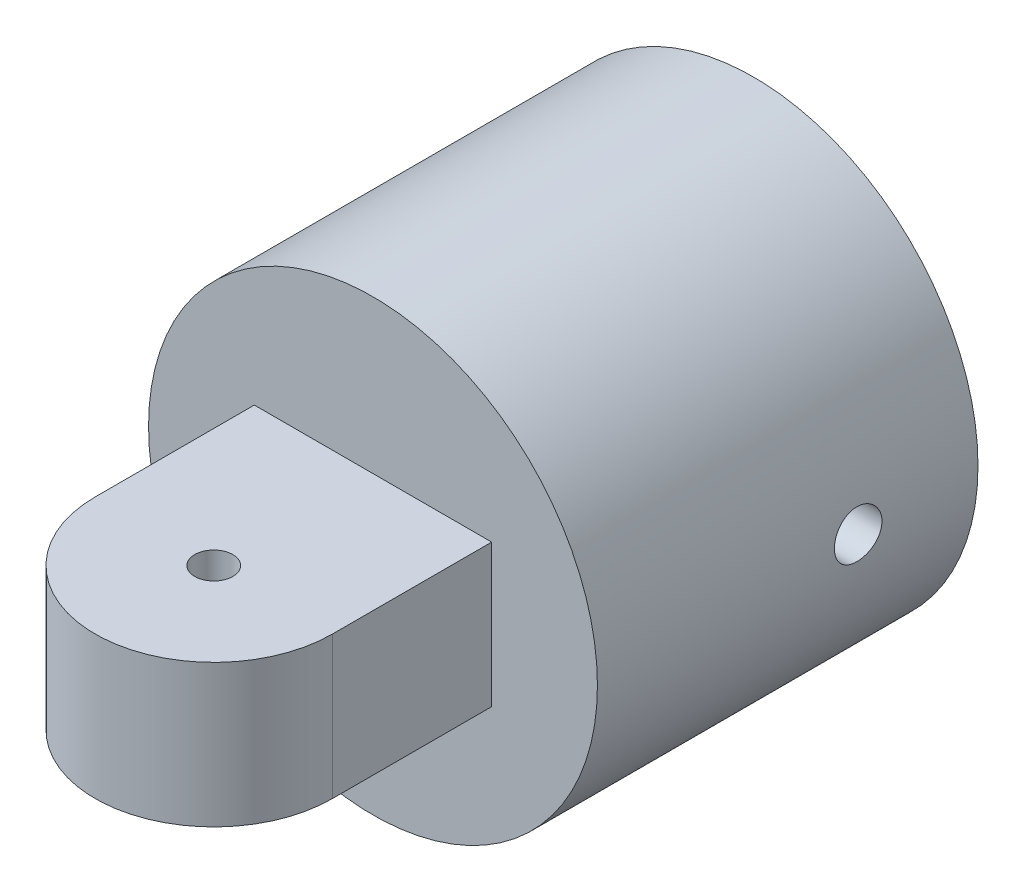
ISO-10303-21;
HEADER;
FILE_DESCRIPTION(('STEP AP214'),'2;1');
FILE_NAME('part.step','',(''),(''),'','','');
FILE_SCHEMA(('AUTOMOTIVE_DESIGN { 1 0 10303 214 1 1 1 1 }'));
ENDSEC;
DATA;
#1=APPLICATION_CONTEXT('core data for automotive mechanical design processes');
#2=APPLICATION_PROTOCOL_DEFINITION('international standard','automotive_design',2000,#1);
#3=PRODUCT_CONTEXT('',#1,'mechanical');
#4=PRODUCT('Part','Part','',(#3));
#5=PRODUCT_RELATED_PRODUCT_CATEGORY('part','',(#4));
#6=PRODUCT_DEFINITION_FORMATION('','',#4);
#7=PRODUCT_DEFINITION_CONTEXT('part definition',#1,'design');
#8=PRODUCT_DEFINITION('design','',#6,#7);
#9=PRODUCT_DEFINITION_SHAPE('','',#8);
#10=(LENGTH_UNIT() NAMED_UNIT(*) SI_UNIT(.MILLI.,.METRE.));
#11=(NAMED_UNIT(*) PLANE_ANGLE_UNIT() SI_UNIT($,.RADIAN.));
#12=(NAMED_UNIT(*) SI_UNIT($,.STERADIAN.) SOLID_ANGLE_UNIT());
#13=UNCERTAINTY_MEASURE_WITH_UNIT(LENGTH_MEASURE(1.E-05),#10,'distance_accuracy_value','');
#14=(GEOMETRIC_REPRESENTATION_CONTEXT(3) GLOBAL_UNCERTAINTY_ASSIGNED_CONTEXT((#13)) GLOBAL_UNIT_ASSIGNED_CONTEXT((#10,
#11,#12)) REPRESENTATION_CONTEXT('',''));
#15=CARTESIAN_POINT('',(0.,0.,0.));
#16=DIRECTION('',(0.,0.,1.));
#17=DIRECTION('',(1.,0.,0.));
#18=AXIS2_PLACEMENT_3D('',#15,#16,#17);
#19=CARTESIAN_POINT('',(0.,7.49,46.7347256348819));
#20=DIRECTION('',(0.,-1.,0.));
#21=DIRECTION('',(0.,0.,-1.));
#22=AXIS2_PLACEMENT_3D('',#19,#20,#21);
#23=CYLINDRICAL_SURFACE('',#22,12.4735073454206);
#24=CARTESIAN_POINT('',(0.,-7.49,46.7347256348819));
#25=DIRECTION('',(0.,1.,0.));
#26=DIRECTION('',(0.,0.,1.));
#27=AXIS2_PLACEMENT_3D('',#24,#25,#26);
#28=CIRCLE('',#27,12.4735073454206);
#29=CARTESIAN_POINT('',(-12.4735073454206,-7.49,46.7347256348819));
#30=VERTEX_POINT('',#29);
#31=CARTESIAN_POINT('',(12.4735073454206,-7.49,46.7347256348819));
#32=VERTEX_POINT('',#31);
#33=EDGE_CURVE('E112',#30,#32,#28,.T.);
#34=ORIENTED_EDGE('',*,*,#33,.T.);
#35=DIRECTION('',(0.,-1.,0.));
#36=VECTOR('',#35,1.);
#37=CARTESIAN_POINT('',(12.4735073454206,7.49,46.7347256348819));
#38=LINE('',#37,#36);
#39=CARTESIAN_POINT('',(12.4735073454206,7.49,46.7347256348819));
#40=VERTEX_POINT('',#39);
#41=EDGE_CURVE('E12',#40,#32,#38,.T.);
#42=ORIENTED_EDGE('',*,*,#41,.F.);
#43=CARTESIAN_POINT('',(0.,7.49,46.7347256348819));
#44=DIRECTION('',(0.,1.,0.));
#45=DIRECTION('',(0.,0.,1.));
#46=AXIS2_PLACEMENT_3D('',#43,#44,#45);
#47=CIRCLE('',#46,12.4735073454206);
#48=CARTESIAN_POINT('',(-12.4735073454206,7.49,46.7347256348819));
#49=VERTEX_POINT('',#48);
#50=EDGE_CURVE('E99',#49,#40,#47,.T.);
#51=ORIENTED_EDGE('',*,*,#50,.F.);
#52=DIRECTION('',(0.,-1.,0.));
#53=VECTOR('',#52,1.);
#54=CARTESIAN_POINT('',(-12.4735073454206,7.49,46.7347256348819));
#55=LINE('',#54,#53);
#56=EDGE_CURVE('E108',#49,#30,#55,.T.);
#57=ORIENTED_EDGE('',*,*,#56,.T.);
#58=EDGE_LOOP('',(#34,#42,#51,#57));
#59=FACE_BOUND('',#58,.T.);
#60=ADVANCED_FACE('F47',(#59),#23,.T.);
#61=CARTESIAN_POINT('',(12.4735073454206,7.49,46.7347256348819));
#62=DIRECTION('',(-1.,0.,0.));
#63=DIRECTION('',(0.,0.,1.));
#64=AXIS2_PLACEMENT_3D('',#61,#62,#63);
#65=PLANE('',#64);
#66=DIRECTION('',(0.,0.,-1.));
#67=VECTOR('',#66,1.);
#68=CARTESIAN_POINT('',(12.4735073454206,-7.49,46.7347256348819));
#69=LINE('',#68,#67);
#70=CARTESIAN_POINT('',(12.4735073454206,-7.49,30.));
#71=VERTEX_POINT('',#70);
#72=EDGE_CURVE('E103',#32,#71,#69,.T.);
#73=ORIENTED_EDGE('',*,*,#72,.T.);
#74=DIRECTION('',(0.,-1.,0.));
#75=VECTOR('',#74,1.);
#76=CARTESIAN_POINT('',(12.4735073454206,7.49,30.));
#77=LINE('',#76,#75);
#78=CARTESIAN_POINT('',(12.4735073454206,7.49,30.));
#79=VERTEX_POINT('',#78);
#80=EDGE_CURVE('E56',#79,#71,#77,.T.);
#81=ORIENTED_EDGE('',*,*,#80,.F.);
#82=DIRECTION('',(0.,0.,-1.));
#83=VECTOR('',#82,1.);
#84=CARTESIAN_POINT('',(12.4735073454206,7.49,46.7347256348819));
#85=LINE('',#84,#83);
#86=EDGE_CURVE('E94',#40,#79,#85,.T.);
#87=ORIENTED_EDGE('',*,*,#86,.F.);
#88=ORIENTED_EDGE('',*,*,#41,.T.);
#89=EDGE_LOOP('',(#73,#81,#87,#88));
#90=FACE_BOUND('',#89,.T.);
#91=ADVANCED_FACE('F102',(#90),#65,.F.);
#92=CARTESIAN_POINT('',(-12.4735073454206,7.49,30.));
#93=DIRECTION('',(0.,0.,1.));
#94=DIRECTION('',(1.,0.,0.));
#95=AXIS2_PLACEMENT_3D('',#92,#93,#94);
#96=PLANE('',#95);
#97=DIRECTION('',(-1.,0.,0.));
#98=VECTOR('',#97,1.);
#99=CARTESIAN_POINT('',(-12.4735073454206,-7.49,30.));
#100=LINE('',#99,#98);
#101=CARTESIAN_POINT('',(-12.4735073454206,-7.49,30.));
#102=VERTEX_POINT('',#101);
#103=EDGE_CURVE('E81',#71,#102,#100,.T.);
#104=ORIENTED_EDGE('',*,*,#103,.T.);
#105=DIRECTION('',(0.,-1.,0.));
#106=VECTOR('',#105,1.);
#107=CARTESIAN_POINT('',(-12.4735073454206,7.49,30.));
#108=LINE('',#107,#106);
#109=CARTESIAN_POINT('',(-12.4735073454206,7.49,30.));
#110=VERTEX_POINT('',#109);
#111=EDGE_CURVE('E104',#110,#102,#108,.T.);
#112=ORIENTED_EDGE('',*,*,#111,.F.);
#113=DIRECTION('',(-1.,0.,0.));
#114=VECTOR('',#113,1.);
#115=CARTESIAN_POINT('',(-12.4735073454206,7.49,30.));
#116=LINE('',#115,#114);
#117=EDGE_CURVE('E97',#79,#110,#116,.T.);
#118=ORIENTED_EDGE('',*,*,#117,.F.);
#119=ORIENTED_EDGE('',*,*,#80,.T.);
#120=EDGE_LOOP('',(#104,#112,#118,#119));
#121=FACE_BOUND('',#120,.T.);
#122=ADVANCED_FACE('F106',(#121),#96,.F.);
#123=CARTESIAN_POINT('',(-12.4735073454206,7.49,30.));
#124=DIRECTION('',(1.,0.,0.));
#125=DIRECTION('',(0.,0.,-1.));
#126=AXIS2_PLACEMENT_3D('',#123,#124,#125);
#127=PLANE('',#126);
#128=DIRECTION('',(0.,0.,1.));
#129=VECTOR('',#128,1.);
#130=CARTESIAN_POINT('',(-12.4735073454206,-7.49,30.));
#131=LINE('',#130,#129);
#132=EDGE_CURVE('E87',#102,#30,#131,.T.);
#133=ORIENTED_EDGE('',*,*,#132,.T.);
#134=ORIENTED_EDGE('',*,*,#56,.F.);
#135=DIRECTION('',(0.,0.,1.));
#136=VECTOR('',#135,1.);
#137=CARTESIAN_POINT('',(-12.4735073454206,7.49,30.));
#138=LINE('',#137,#136);
#139=EDGE_CURVE('E64',#110,#49,#138,.T.);
#140=ORIENTED_EDGE('',*,*,#139,.F.);
#141=ORIENTED_EDGE('',*,*,#111,.T.);
#142=EDGE_LOOP('',(#133,#134,#140,#141));
#143=FACE_BOUND('',#142,.T.);
#144=ADVANCED_FACE('F120',(#143),#127,.F.);
#145=CARTESIAN_POINT('',(0.,7.49,46.7347256348819));
#146=DIRECTION('',(0.,1.,0.));
#147=DIRECTION('',(0.,0.,1.));
#148=AXIS2_PLACEMENT_3D('',#145,#146,#147);
#149=PLANE('',#148);
#150=CARTESIAN_POINT('',(0.,7.49,46.7347256348819));
#151=DIRECTION('',(0.,1.,0.));
#152=DIRECTION('',(0.,0.,1.));
#153=AXIS2_PLACEMENT_3D('',#150,#151,#152);
#154=CIRCLE('',#153,2.);
#155=CARTESIAN_POINT('',(0.,7.49,48.7347256348819));
#156=VERTEX_POINT('',#155);
#157=EDGE_CURVE('E115',#156,#156,#154,.T.);
#158=ORIENTED_EDGE('',*,*,#157,.F.);
#159=EDGE_LOOP('',(#158));
#160=FACE_BOUND('',#159,.T.);
#161=ORIENTED_EDGE('',*,*,#50,.T.);
#162=ORIENTED_EDGE('',*,*,#86,.T.);
#163=ORIENTED_EDGE('',*,*,#117,.T.);
#164=ORIENTED_EDGE('',*,*,#139,.T.);
#165=EDGE_LOOP('',(#161,#162,#163,#164));
#166=FACE_BOUND('',#165,.T.);
#167=ADVANCED_FACE('F95',(#160,#166),#149,.T.);
#168=CARTESIAN_POINT('',(0.,-7.49,46.7347256348819));
#169=DIRECTION('',(0.,1.,0.));
#170=DIRECTION('',(0.,0.,1.));
#171=AXIS2_PLACEMENT_3D('',#168,#169,#170);
#172=PLANE('',#171);
#173=CARTESIAN_POINT('',(0.,-7.49,46.7347256348819));
#174=DIRECTION('',(0.,1.,0.));
#175=DIRECTION('',(0.,0.,1.));
#176=AXIS2_PLACEMENT_3D('',#173,#174,#175);
#177=CIRCLE('',#176,2.);
#178=CARTESIAN_POINT('',(0.,-7.49,48.7347256348819));
#179=VERTEX_POINT('',#178);
#180=EDGE_CURVE('E50',#179,#179,#177,.T.);
#181=ORIENTED_EDGE('',*,*,#180,.T.);
#182=EDGE_LOOP('',(#181));
#183=FACE_BOUND('',#182,.T.);
#184=ORIENTED_EDGE('',*,*,#33,.F.);
#185=ORIENTED_EDGE('',*,*,#132,.F.);
#186=ORIENTED_EDGE('',*,*,#103,.F.);
#187=ORIENTED_EDGE('',*,*,#72,.F.);
#188=EDGE_LOOP('',(#184,#185,#186,#187));
#189=FACE_BOUND('',#188,.T.);
#190=ADVANCED_FACE('F123',(#183,#189),#172,.F.);
#191=CARTESIAN_POINT('',(0.,-30.01,46.7347256348819));
#192=DIRECTION('',(0.,1.,0.));
#193=DIRECTION('',(0.,0.,1.));
#194=AXIS2_PLACEMENT_3D('',#191,#192,#193);
#195=CYLINDRICAL_SURFACE('',#194,2.);
#196=ORIENTED_EDGE('',*,*,#157,.T.);
#197=EDGE_LOOP('',(#196));
#198=FACE_BOUND('',#197,.T.);
#199=ORIENTED_EDGE('',*,*,#180,.F.);
#200=EDGE_LOOP('',(#199));
#201=FACE_BOUND('',#200,.T.);
#202=ADVANCED_FACE('F133',(#198,#201),#195,.F.);
#203=CLOSED_SHELL('',(#60,#91,#122,#144,#167,#190,#202));
#204=MANIFOLD_SOLID_BREP('B2',#203);
#205=CARTESIAN_POINT('',(0.,0.,-10.));
#206=DIRECTION('',(0.,0.,1.));
#207=DIRECTION('',(1.,0.,0.));
#208=AXIS2_PLACEMENT_3D('',#205,#206,#207);
#209=CYLINDRICAL_SURFACE('',#208,23.59);
#210=CARTESIAN_POINT('',(23.59,0.,0.0926552802489322));
#211=CARTESIAN_POINT('',(23.5899983030771,0.140004890382727,0.0926613199458633));
#212=CARTESIAN_POINT('',(23.5887403958274,0.280101235515981,0.104455711463178));
#213=CARTESIAN_POINT('',(23.5838433207522,0.556406756116709,0.151326022940829));
#214=CARTESIAN_POINT('',(23.5802015594957,0.69261152926387,0.186427299413584));
#215=CARTESIAN_POINT('',(23.5709476853588,0.957092956934866,0.278875302944245));
#216=CARTESIAN_POINT('',(23.5653367927148,1.0853744636063,0.336208255722926));
#217=CARTESIAN_POINT('',(23.552771315274,1.33046665616082,0.471464621819369));
#218=CARTESIAN_POINT('',(23.545816989654,1.447279548038,0.549384064630058));
#219=CARTESIAN_POINT('',(23.5313118555805,1.66661511804326,0.723937200079462));
#220=CARTESIAN_POINT('',(23.5237590029897,1.76908519934517,0.820636819953338));
#221=CARTESIAN_POINT('',(23.5089248770597,1.95637410950071,1.02986445990666));
#222=CARTESIAN_POINT('',(23.501643616563,2.04119210452785,1.14239322728238));
#223=CARTESIAN_POINT('',(23.4881564147091,2.19095784039705,1.38041720155939));
#224=CARTESIAN_POINT('',(23.4819530867172,2.25585757467481,1.5059427751934));
#225=CARTESIAN_POINT('',(23.4713498936534,2.36363798842801,1.76618699339055));
#226=CARTESIAN_POINT('',(23.4669499788572,2.40651927501024,1.90090538436738));
#227=CARTESIAN_POINT('',(23.4604705499611,2.46888865123076,2.17517218178249));
#228=CARTESIAN_POINT('',(23.4583823443468,2.48846438567586,2.31470044863175));
#229=CARTESIAN_POINT('',(23.4567358887997,2.50393796281383,2.59507646445228));
#230=CARTESIAN_POINT('',(23.4571775646821,2.49983649980298,2.73592417461205));
#231=CARTESIAN_POINT('',(23.4605330256352,2.46814427950293,3.01433531755156));
#232=CARTESIAN_POINT('',(23.4634367197314,2.44064940226408,3.1519098033478));
#233=CARTESIAN_POINT('',(23.4713732901132,2.36310010922259,3.42048065063793));
#234=CARTESIAN_POINT('',(23.4764061983395,2.31304535499427,3.55147691341767));
#235=CARTESIAN_POINT('',(23.4880456955699,2.19169195639642,3.80347459335227));
#236=CARTESIAN_POINT('',(23.4946554161757,2.12035096524796,3.92445546722919));
#237=CARTESIAN_POINT('',(23.5087011989002,1.95848059921138,4.15276329873786));
#238=CARTESIAN_POINT('',(23.5161372881916,1.86795059325972,4.26008980713665));
#239=CARTESIAN_POINT('',(23.5310428996824,1.66973740575721,4.458599319853));
#240=CARTESIAN_POINT('',(23.538512404975,1.56197145460676,4.54969969981414));
#241=CARTESIAN_POINT('',(23.5526085089759,1.3326323311139,4.71252990865277));
#242=CARTESIAN_POINT('',(23.5592351065534,1.21105914024982,4.78425971154526));
#243=CARTESIAN_POINT('',(23.5709013286536,0.95749788958243,4.90631004336452));
#244=CARTESIAN_POINT('',(23.5759406264525,0.825507692564154,4.95662616532622));
#245=CARTESIAN_POINT('',(23.583861220576,0.554887088841686,5.03435919144851));
#246=CARTESIAN_POINT('',(23.5867425894063,0.416256905405358,5.06177686499289));
#247=CARTESIAN_POINT('',(23.5900133370954,0.13700681251426,5.09282939153079));
#248=CARTESIAN_POINT('',(23.5904146578676,-0.00360028917354522,5.09657821652709));
#249=CARTESIAN_POINT('',(23.5887121615328,-0.283440751422993,5.0804862883302));
#250=CARTESIAN_POINT('',(23.5866083825154,-0.422674132839351,5.06064589380686));
#251=CARTESIAN_POINT('',(23.5801396699159,-0.695484265843108,4.99803330625996));
#252=CARTESIAN_POINT('',(23.5757800202398,-0.82907345030202,4.95531469253733));
#253=CARTESIAN_POINT('',(23.5652884237549,-1.08719009199438,4.84821349346598));
#254=CARTESIAN_POINT('',(23.5591564326133,-1.21171732245822,4.78383036620326));
#255=CARTESIAN_POINT('',(23.5457757711934,-1.44868911728913,4.63494660503013));
#256=CARTESIAN_POINT('',(23.5385229945229,-1.5610865587743,4.55037134276324));
#257=CARTESIAN_POINT('',(23.52372718167,-1.77013069103516,4.36361078206297));
#258=CARTESIAN_POINT('',(23.5161841372913,-1.86677693664698,4.26142498608454));
#259=CARTESIAN_POINT('',(23.5016218005983,-2.04197287593517,4.04184567955562));
#260=CARTESIAN_POINT('',(23.4946047560305,-2.12044760211723,3.9243921843883));
#261=CARTESIAN_POINT('',(23.4819237546767,-2.25655697915346,3.67790635612999));
#262=CARTESIAN_POINT('',(23.4762597774361,-2.31419194505344,3.54887419811666));
#263=CARTESIAN_POINT('',(23.4669405565708,-2.40686115244347,3.28314754804815));
#264=CARTESIAN_POINT('',(23.4632813962425,-2.44193948508609,3.14646857538588));
#265=CARTESIAN_POINT('',(23.4583741704025,-2.48864252138218,2.86911969623295));
#266=CARTESIAN_POINT('',(23.4571260264327,-2.50026798822697,2.72844991976008));
#267=CARTESIAN_POINT('',(23.4571839502349,-2.49972395442829,2.44785777854413));
#268=CARTESIAN_POINT('',(23.4584773771247,-2.48767221595611,2.30793516802854));
#269=CARTESIAN_POINT('',(23.4634457046064,-2.44036333007009,2.03211468883736));
#270=CARTESIAN_POINT('',(23.4671206074198,-2.40510616101156,1.89621682391594));
#271=CARTESIAN_POINT('',(23.4764342239078,-2.31242071265327,1.63230763194389));
#272=CARTESIAN_POINT('',(23.4820725871918,-2.25499638901096,1.50429490253946));
#273=CARTESIAN_POINT('',(23.4946785069669,-2.11961864177243,1.25970540678357));
#274=CARTESIAN_POINT('',(23.5016460613569,-2.04166525062717,1.14312862235536));
#275=CARTESIAN_POINT('',(23.5161668347073,-1.86700081845345,0.924116831189273));
#276=CARTESIAN_POINT('',(23.5237226921116,-1.77020196065382,0.821752031803801));
#277=CARTESIAN_POINT('',(23.538544757639,-1.56077124206543,0.634668945639541));
#278=CARTESIAN_POINT('',(23.5458108962116,-1.44813560849441,0.549954875749898));
#279=CARTESIAN_POINT('',(23.5592562744924,-1.20987998501282,0.400387762942936));
#280=CARTESIAN_POINT('',(23.5654324240323,-1.08422463280158,0.335590812636316));
#281=CARTESIAN_POINT('',(23.5759690180188,-0.82382941268191,0.228104247656762));
#282=CARTESIAN_POINT('',(23.5803314924243,-0.689099898452412,0.185389903872182));
#283=CARTESIAN_POINT('',(23.5856627304559,-0.461351179347135,0.133839267291639));
#284=CARTESIAN_POINT('',(23.5872815484788,-0.369783882248667,0.11841660990805));
#285=CARTESIAN_POINT('',(23.5894507428818,-0.185491103341335,0.0978226399343499));
#286=CARTESIAN_POINT('',(23.5900011243616,-0.0927656270625248,0.0926512784153423));
#287=CARTESIAN_POINT('',(23.59,0.,0.0926552802489322));
#288=B_SPLINE_CURVE_WITH_KNOTS('',3,(#210,#211,#212,#213,#214,#215,#216,#217,#218,#219,#220,
#221,#222,#223,#224,#225,#226,#227,#228,#229,#230,#231,#232,#233,#234,#235,#236,#237,#238,#239,
#240,#241,#242,#243,#244,#245,#246,#247,#248,#249,#250,#251,#252,#253,#254,#255,#256,#257,#258,
#259,#260,#261,#262,#263,#264,#265,#266,#267,#268,#269,#270,#271,#272,#273,#274,#275,#276,#277,
#278,#279,#280,#281,#282,#283,#284,#285,#286,#287),.UNSPECIFIED.,.T.,.F.,(4,2,2,2,2,2,2,2,2,2,2,
2,2,2,2,2,2,2,2,2,2,2,2,2,2,2,2,2,2,2,2,2,2,2,2,2,2,2,4),(0.,0.41967590487986,0.839809142071956,
1.25968248839799,1.67947491298238,2.10076854982229,2.52208208267318,2.94440322328857,
3.36671271876888,3.78742897392592,4.2081328923083,4.62712077768863,5.04611494860777,
5.46594828694184,5.88579543435547,6.30772288072299,6.72965089308983,7.15166569688249,
7.57366632048221,7.993633335554,8.41359396518424,8.8325753478515,9.25156721165667,
9.67213228156076,10.0927092355103,10.5149915581614,10.9372674966777,11.3587154885586,
11.7801497656706,12.1994932813853,12.6188371882399,13.038106299089,13.4573747471904,
13.878645816124,14.3000174147048,14.7225650736196,15.1446385137549,15.4227122595513,
15.7007846781132),.UNSPECIFIED.);
#289=CARTESIAN_POINT('',(23.59,0.,0.0926552802489322));
#290=VERTEX_POINT('',#289);
#291=EDGE_CURVE('E196',#290,#290,#288,.T.);
#292=ORIENTED_EDGE('',*,*,#291,.F.);
#293=EDGE_LOOP('',(#292));
#294=FACE_BOUND('',#293,.T.);
#295=CARTESIAN_POINT('',(-23.59,0.,5.09265528024894));
#296=CARTESIAN_POINT('',(-23.5899983030771,0.140004890382727,5.09264924055201));
#297=CARTESIAN_POINT('',(-23.5887403958274,0.280101235515981,5.08085484903469));
#298=CARTESIAN_POINT('',(-23.5838433207522,0.556406756116709,5.03398453755704));
#299=CARTESIAN_POINT('',(-23.5802015594957,0.69261152926387,4.99888326108428));
#300=CARTESIAN_POINT('',(-23.5709476853588,0.957092956934866,4.90643525755362));
#301=CARTESIAN_POINT('',(-23.5653367927148,1.0853744636063,4.84910230477494));
#302=CARTESIAN_POINT('',(-23.552771315274,1.33046665616082,4.7138459386785));
#303=CARTESIAN_POINT('',(-23.545816989654,1.447279548038,4.63592649586781));
#304=CARTESIAN_POINT('',(-23.5313118555805,1.66661511804326,4.46137336041841));
#305=CARTESIAN_POINT('',(-23.5237590029897,1.76908519934517,4.36467374054453));
#306=CARTESIAN_POINT('',(-23.5089248770597,1.95637410950071,4.15544610059121));
#307=CARTESIAN_POINT('',(-23.501643616563,2.04119210452785,4.04291733321549));
#308=CARTESIAN_POINT('',(-23.4881564147091,2.19095784039705,3.80489335893848));
#309=CARTESIAN_POINT('',(-23.4819530867172,2.25585757467481,3.67936778530447));
#310=CARTESIAN_POINT('',(-23.4713498936534,2.36363798842801,3.41912356710732));
#311=CARTESIAN_POINT('',(-23.4669499788572,2.40651927501024,3.28440517613049));
#312=CARTESIAN_POINT('',(-23.4604705499611,2.46888865123076,3.01013837871538));
#313=CARTESIAN_POINT('',(-23.4583823443468,2.48846438567586,2.87061011186612));
#314=CARTESIAN_POINT('',(-23.4567358887997,2.50393796281383,2.59023409604559));
#315=CARTESIAN_POINT('',(-23.4571775646821,2.49983649980298,2.44938638588582));
#316=CARTESIAN_POINT('',(-23.4605330256352,2.46814427950293,2.17097524294631));
#317=CARTESIAN_POINT('',(-23.4634367197314,2.44064940226408,2.03340075715007));
#318=CARTESIAN_POINT('',(-23.4713732901132,2.36310010922259,1.76482990985994));
#319=CARTESIAN_POINT('',(-23.4764061983395,2.31304535499427,1.63383364708019));
#320=CARTESIAN_POINT('',(-23.4880456955699,2.19169195639642,1.3818359671456));
#321=CARTESIAN_POINT('',(-23.4946554161757,2.12035096524796,1.26085509326867));
#322=CARTESIAN_POINT('',(-23.5087011989002,1.95848059921138,1.03254726176001));
#323=CARTESIAN_POINT('',(-23.5161372881916,1.86795059325972,0.925220753361215));
#324=CARTESIAN_POINT('',(-23.5310428996824,1.66973740575721,0.726711240644872));
#325=CARTESIAN_POINT('',(-23.538512404975,1.56197145460676,0.63561086068373));
#326=CARTESIAN_POINT('',(-23.5526085089759,1.3326323311139,0.472780651845098));
#327=CARTESIAN_POINT('',(-23.5592351065534,1.21105914024982,0.401050848952614));
#328=CARTESIAN_POINT('',(-23.5709013286536,0.95749788958243,0.27900051713335));
#329=CARTESIAN_POINT('',(-23.5759406264525,0.825507692564154,0.22868439517165));
#330=CARTESIAN_POINT('',(-23.583861220576,0.554887088841686,0.150951369049361));
#331=CARTESIAN_POINT('',(-23.5867425894063,0.416256905405359,0.123533695504974));
#332=CARTESIAN_POINT('',(-23.5900133370954,0.13700681251426,0.0924811689670737));
#333=CARTESIAN_POINT('',(-23.5904146578676,-0.00360028917354503,0.0887323439707736));
#334=CARTESIAN_POINT('',(-23.5887121615328,-0.283440751422993,0.104824272167669));
#335=CARTESIAN_POINT('',(-23.5866083825154,-0.422674132839351,0.124664666691007));
#336=CARTESIAN_POINT('',(-23.5801396699159,-0.695484265843107,0.187277254237909));
#337=CARTESIAN_POINT('',(-23.5757800202398,-0.829073450302019,0.229995867960535));
#338=CARTESIAN_POINT('',(-23.5652884237549,-1.08719009199438,0.337097067031887));
#339=CARTESIAN_POINT('',(-23.5591564326133,-1.21171732245822,0.401480194294604));
#340=CARTESIAN_POINT('',(-23.5457757711934,-1.44868911728913,0.550363955467736));
#341=CARTESIAN_POINT('',(-23.5385229945229,-1.5610865587743,0.63493921773463));
#342=CARTESIAN_POINT('',(-23.52372718167,-1.77013069103516,0.821699778434904));
#343=CARTESIAN_POINT('',(-23.5161841372913,-1.86677693664698,0.923885574413333));
#344=CARTESIAN_POINT('',(-23.5016218005983,-2.04197287593517,1.14346488094225));
#345=CARTESIAN_POINT('',(-23.4946047560305,-2.12044760211723,1.26091837610957));
#346=CARTESIAN_POINT('',(-23.4819237546767,-2.25655697915346,1.50740420436787));
#347=CARTESIAN_POINT('',(-23.4762597774361,-2.31419194505344,1.63643636238121));
#348=CARTESIAN_POINT('',(-23.4669405565708,-2.40686115244347,1.90216301244972));
#349=CARTESIAN_POINT('',(-23.4632813962425,-2.44193948508609,2.03884198511199));
#350=CARTESIAN_POINT('',(-23.4583741704025,-2.48864252138218,2.31619086426492));
#351=CARTESIAN_POINT('',(-23.4571260264327,-2.50026798822697,2.45686064073779));
#352=CARTESIAN_POINT('',(-23.4571839502349,-2.49972395442829,2.73745278195374));
#353=CARTESIAN_POINT('',(-23.4584773771247,-2.48767221595611,2.87737539246933));
#354=CARTESIAN_POINT('',(-23.4634457046064,-2.44036333007009,3.15319587166051));
#355=CARTESIAN_POINT('',(-23.4671206074198,-2.40510616101156,3.28909373658193));
#356=CARTESIAN_POINT('',(-23.4764342239078,-2.31242071265327,3.55300292855398));
#357=CARTESIAN_POINT('',(-23.4820725871918,-2.25499638901096,3.6810156579584));
#358=CARTESIAN_POINT('',(-23.4946785069669,-2.11961864177243,3.92560515371429));
#359=CARTESIAN_POINT('',(-23.5016460613569,-2.04166525062717,4.04218193814251));
#360=CARTESIAN_POINT('',(-23.5161668347073,-1.86700081845346,4.2611937293086));
#361=CARTESIAN_POINT('',(-23.5237226921116,-1.77020196065382,4.36355852869407));
#362=CARTESIAN_POINT('',(-23.538544757639,-1.56077124206543,4.55064161485833));
#363=CARTESIAN_POINT('',(-23.5458108962116,-1.44813560849441,4.63535568474797));
#364=CARTESIAN_POINT('',(-23.5592562744924,-1.20987998501282,4.78492279755493));
#365=CARTESIAN_POINT('',(-23.5654324240323,-1.08422463280158,4.84971974786155));
#366=CARTESIAN_POINT('',(-23.5759690180188,-0.82382941268191,4.95720631284111));
#367=CARTESIAN_POINT('',(-23.5803314924243,-0.689099898452412,4.99992065662569));
#368=CARTESIAN_POINT('',(-23.5856627304559,-0.461351179347136,5.05147129320623));
#369=CARTESIAN_POINT('',(-23.5872815484788,-0.369783882248668,5.06689395058982));
#370=CARTESIAN_POINT('',(-23.5894507428818,-0.185491103341335,5.08748792056352));
#371=CARTESIAN_POINT('',(-23.5900011243616,-0.0927656270625252,5.09265928208253));
#372=CARTESIAN_POINT('',(-23.59,0.,5.09265528024894));
#373=B_SPLINE_CURVE_WITH_KNOTS('',3,(#295,#296,#297,#298,#299,#300,#301,#302,#303,#304,#305,
#306,#307,#308,#309,#310,#311,#312,#313,#314,#315,#316,#317,#318,#319,#320,#321,#322,#323,#324,
#325,#326,#327,#328,#329,#330,#331,#332,#333,#334,#335,#336,#337,#338,#339,#340,#341,#342,#343,
#344,#345,#346,#347,#348,#349,#350,#351,#352,#353,#354,#355,#356,#357,#358,#359,#360,#361,#362,
#363,#364,#365,#366,#367,#368,#369,#370,#371,#372),.UNSPECIFIED.,.T.,.F.,(4,2,2,2,2,2,2,2,2,2,2,
2,2,2,2,2,2,2,2,2,2,2,2,2,2,2,2,2,2,2,2,2,2,2,2,2,2,2,4),(0.,0.41967590487986,0.839809142071956,
1.25968248839799,1.67947491298238,2.10076854982229,2.52208208267318,2.94440322328858,
3.36671271876888,3.78742897392592,4.2081328923083,4.62712077768863,5.04611494860777,
5.46594828694184,5.88579543435547,6.30772288072299,6.72965089308984,7.15166569688249,
7.57366632048221,7.99363333555401,8.41359396518424,8.8325753478515,9.25156721165667,
9.67213228156076,10.0927092355103,10.5149915581614,10.9372674966777,11.3587154885586,
11.7801497656706,12.1994932813853,12.6188371882399,13.038106299089,13.4573747471904,
13.878645816124,14.3000174147048,14.7225650736196,15.1446385137549,15.4227122595513,
15.7007846781132),.UNSPECIFIED.);
#374=CARTESIAN_POINT('',(-23.59,0.,5.09265528024894));
#375=VERTEX_POINT('',#374);
#376=EDGE_CURVE('E212',#375,#375,#373,.T.);
#377=ORIENTED_EDGE('',*,*,#376,.F.);
#378=EDGE_LOOP('',(#377));
#379=FACE_BOUND('',#378,.T.);
#380=CARTESIAN_POINT('',(0.,0.,-10.));
#381=DIRECTION('',(0.,0.,1.));
#382=DIRECTION('',(1.,0.,0.));
#383=AXIS2_PLACEMENT_3D('',#380,#381,#382);
#384=CIRCLE('',#383,23.59);
#385=CARTESIAN_POINT('',(23.59,0.,-10.));
#386=VERTEX_POINT('',#385);
#387=EDGE_CURVE('E46',#386,#386,#384,.T.);
#388=ORIENTED_EDGE('',*,*,#387,.T.);
#389=EDGE_LOOP('',(#388));
#390=FACE_BOUND('',#389,.T.);
#391=CARTESIAN_POINT('',(0.,0.,30.));
#392=DIRECTION('',(0.,0.,1.));
#393=DIRECTION('',(1.,0.,0.));
#394=AXIS2_PLACEMENT_3D('',#391,#392,#393);
#395=CIRCLE('',#394,23.59);
#396=CARTESIAN_POINT('',(23.59,0.,30.));
#397=VERTEX_POINT('',#396);
#398=EDGE_CURVE('E205',#397,#397,#395,.T.);
#399=ORIENTED_EDGE('',*,*,#398,.F.);
#400=EDGE_LOOP('',(#399));
#401=FACE_BOUND('',#400,.T.);
#402=ADVANCED_FACE('F192',(#294,#379,#390,#401),#209,.T.);
#403=CARTESIAN_POINT('',(0.,0.,-10.));
#404=DIRECTION('',(0.,0.,1.));
#405=DIRECTION('',(1.,0.,0.));
#406=AXIS2_PLACEMENT_3D('',#403,#404,#405);
#407=PLANE('',#406);
#408=ORIENTED_EDGE('',*,*,#387,.F.);
#409=EDGE_LOOP('',(#408));
#410=FACE_BOUND('',#409,.T.);
#411=ADVANCED_FACE('F226',(#410),#407,.F.);
#412=CARTESIAN_POINT('',(0.,0.,30.));
#413=DIRECTION('',(0.,0.,1.));
#414=DIRECTION('',(1.,0.,0.));
#415=AXIS2_PLACEMENT_3D('',#412,#413,#414);
#416=PLANE('',#415);
#417=ORIENTED_EDGE('',*,*,#398,.T.);
#418=EDGE_LOOP('',(#417));
#419=FACE_BOUND('',#418,.T.);
#420=ADVANCED_FACE('F222',(#419),#416,.T.);
#421=CARTESIAN_POINT('',(57.5264926545794,0.,2.59265528024893));
#422=DIRECTION('',(-1.,0.,0.));
#423=DIRECTION('',(0.,0.,1.));
#424=AXIS2_PLACEMENT_3D('',#421,#422,#423);
#425=CYLINDRICAL_SURFACE('',#424,2.5);
#426=ORIENTED_EDGE('',*,*,#291,.T.);
#427=EDGE_LOOP('',(#426));
#428=FACE_BOUND('',#427,.T.);
#429=ORIENTED_EDGE('',*,*,#376,.T.);
#430=EDGE_LOOP('',(#429));
#431=FACE_BOUND('',#430,.T.);
#432=ADVANCED_FACE('F218',(#428,#431),#425,.F.);
#433=CLOSED_SHELL('',(#402,#411,#420,#432));
#434=MANIFOLD_SOLID_BREP('B6',#433);
#435=ADVANCED_BREP_SHAPE_REPRESENTATION('',(#18,#204,#434),#14);
#436=SHAPE_DEFINITION_REPRESENTATION(#9,#435);
ENDSEC;
END-ISO-10303-21;
